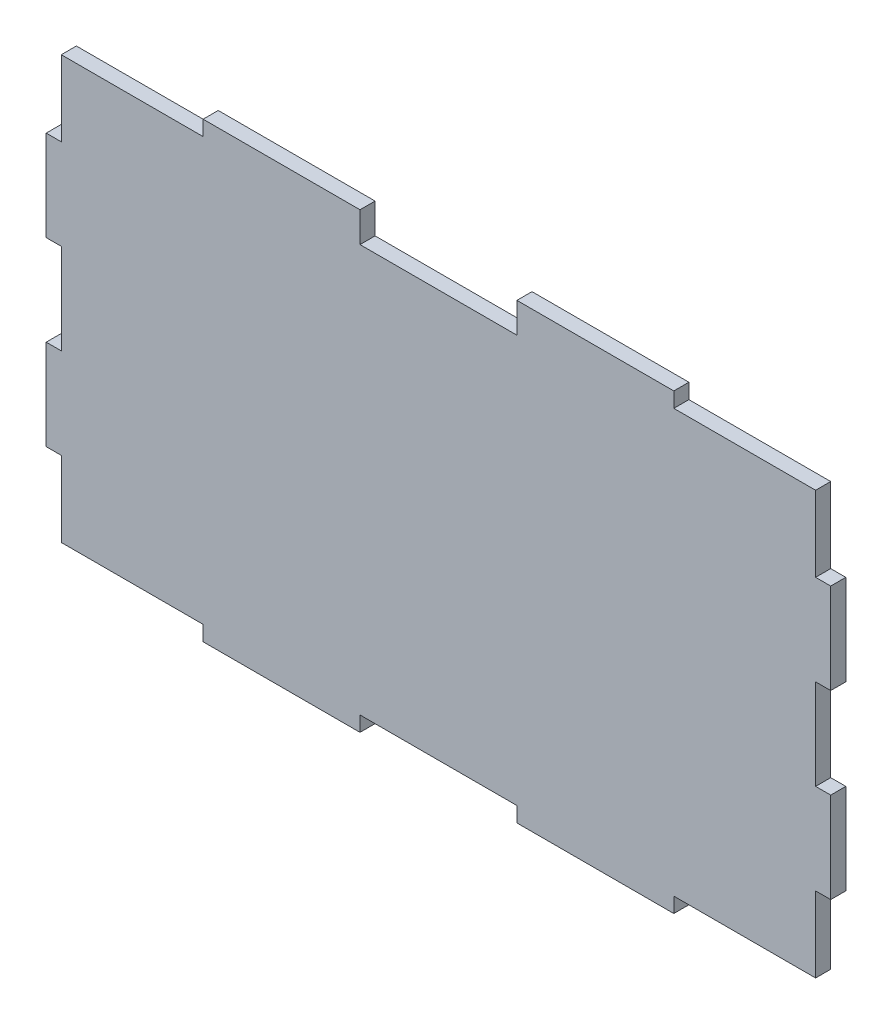
ISO-10303-21;
HEADER;
FILE_DESCRIPTION(('STEP AP214'),'2;1');
FILE_NAME('part.step','',(''),(''),'','','');
FILE_SCHEMA(('AUTOMOTIVE_DESIGN { 1 0 10303 214 1 1 1 1 }'));
ENDSEC;
DATA;
#1=APPLICATION_CONTEXT('core data for automotive mechanical design processes');
#2=APPLICATION_PROTOCOL_DEFINITION('international standard','automotive_design',2000,#1);
#3=PRODUCT_CONTEXT('',#1,'mechanical');
#4=PRODUCT('Part','Part','',(#3));
#5=PRODUCT_RELATED_PRODUCT_CATEGORY('part','',(#4));
#6=PRODUCT_DEFINITION_FORMATION('','',#4);
#7=PRODUCT_DEFINITION_CONTEXT('part definition',#1,'design');
#8=PRODUCT_DEFINITION('design','',#6,#7);
#9=PRODUCT_DEFINITION_SHAPE('','',#8);
#10=(LENGTH_UNIT() NAMED_UNIT(*) SI_UNIT(.MILLI.,.METRE.));
#11=(NAMED_UNIT(*) PLANE_ANGLE_UNIT() SI_UNIT($,.RADIAN.));
#12=(NAMED_UNIT(*) SI_UNIT($,.STERADIAN.) SOLID_ANGLE_UNIT());
#13=UNCERTAINTY_MEASURE_WITH_UNIT(LENGTH_MEASURE(1.E-05),#10,'distance_accuracy_value','');
#14=(GEOMETRIC_REPRESENTATION_CONTEXT(3) GLOBAL_UNCERTAINTY_ASSIGNED_CONTEXT((#13)) GLOBAL_UNIT_ASSIGNED_CONTEXT((#10,
#11,#12)) REPRESENTATION_CONTEXT('',''));
#15=CARTESIAN_POINT('',(0.,0.,0.));
#16=DIRECTION('',(0.,0.,1.));
#17=DIRECTION('',(1.,0.,0.));
#18=AXIS2_PLACEMENT_3D('',#15,#16,#17);
#19=CARTESIAN_POINT('',(52.,150.,5.));
#20=DIRECTION('',(1.,0.,0.));
#21=DIRECTION('',(0.,1.,0.));
#22=AXIS2_PLACEMENT_3D('',#19,#20,#21);
#23=PLANE('',#22);
#24=DIRECTION('',(0.,-1.,0.));
#25=VECTOR('',#24,1.);
#26=CARTESIAN_POINT('',(52.,150.,0.));
#27=LINE('',#26,#25);
#28=CARTESIAN_POINT('',(52.,150.,0.));
#29=VERTEX_POINT('',#28);
#30=CARTESIAN_POINT('',(52.,145.,0.));
#31=VERTEX_POINT('',#30);
#32=EDGE_CURVE('E303',#29,#31,#27,.T.);
#33=ORIENTED_EDGE('',*,*,#32,.T.);
#34=DIRECTION('',(0.,0.,-1.));
#35=VECTOR('',#34,1.);
#36=CARTESIAN_POINT('',(52.,145.,5.));
#37=LINE('',#36,#35);
#38=CARTESIAN_POINT('',(52.,145.,5.));
#39=VERTEX_POINT('',#38);
#40=EDGE_CURVE('E43',#39,#31,#37,.T.);
#41=ORIENTED_EDGE('',*,*,#40,.F.);
#42=DIRECTION('',(0.,-1.,0.));
#43=VECTOR('',#42,1.);
#44=CARTESIAN_POINT('',(52.,150.,5.));
#45=LINE('',#44,#43);
#46=CARTESIAN_POINT('',(52.,150.,5.));
#47=VERTEX_POINT('',#46);
#48=EDGE_CURVE('E371',#47,#39,#45,.T.);
#49=ORIENTED_EDGE('',*,*,#48,.F.);
#50=DIRECTION('',(0.,0.,-1.));
#51=VECTOR('',#50,1.);
#52=CARTESIAN_POINT('',(52.,150.,5.));
#53=LINE('',#52,#51);
#54=EDGE_CURVE('E302',#47,#29,#53,.T.);
#55=ORIENTED_EDGE('',*,*,#54,.T.);
#56=EDGE_LOOP('',(#33,#41,#49,#55));
#57=FACE_BOUND('',#56,.T.);
#58=ADVANCED_FACE('F36',(#57),#23,.F.);
#59=CARTESIAN_POINT('',(52.,145.,5.));
#60=DIRECTION('',(0.,-1.,0.));
#61=DIRECTION('',(0.,0.,-1.));
#62=AXIS2_PLACEMENT_3D('',#59,#60,#61);
#63=PLANE('',#62);
#64=DIRECTION('',(-1.,0.,0.));
#65=VECTOR('',#64,1.);
#66=CARTESIAN_POINT('',(52.,145.,0.));
#67=LINE('',#66,#65);
#68=CARTESIAN_POINT('',(5.,145.,0.));
#69=VERTEX_POINT('',#68);
#70=EDGE_CURVE('E306',#31,#69,#67,.T.);
#71=ORIENTED_EDGE('',*,*,#70,.T.);
#72=DIRECTION('',(0.,0.,-1.));
#73=VECTOR('',#72,1.);
#74=CARTESIAN_POINT('',(5.,145.,5.));
#75=LINE('',#74,#73);
#76=CARTESIAN_POINT('',(5.,145.,5.));
#77=VERTEX_POINT('',#76);
#78=EDGE_CURVE('E459',#77,#69,#75,.T.);
#79=ORIENTED_EDGE('',*,*,#78,.F.);
#80=DIRECTION('',(-1.,0.,0.));
#81=VECTOR('',#80,1.);
#82=CARTESIAN_POINT('',(52.,145.,5.));
#83=LINE('',#82,#81);
#84=EDGE_CURVE('E179',#39,#77,#83,.T.);
#85=ORIENTED_EDGE('',*,*,#84,.F.);
#86=ORIENTED_EDGE('',*,*,#40,.T.);
#87=EDGE_LOOP('',(#71,#79,#85,#86));
#88=FACE_BOUND('',#87,.T.);
#89=ADVANCED_FACE('F462',(#88),#63,.F.);
#90=CARTESIAN_POINT('',(5.,120.,5.));
#91=DIRECTION('',(1.,0.,0.));
#92=DIRECTION('',(0.,1.,0.));
#93=AXIS2_PLACEMENT_3D('',#90,#91,#92);
#94=PLANE('',#93);
#95=DIRECTION('',(0.,-1.,0.));
#96=VECTOR('',#95,1.);
#97=CARTESIAN_POINT('',(5.,120.,0.));
#98=LINE('',#97,#96);
#99=CARTESIAN_POINT('',(5.,120.,0.));
#100=VERTEX_POINT('',#99);
#101=EDGE_CURVE('E308',#69,#100,#98,.T.);
#102=ORIENTED_EDGE('',*,*,#101,.T.);
#103=DIRECTION('',(0.,0.,-1.));
#104=VECTOR('',#103,1.);
#105=CARTESIAN_POINT('',(5.,120.,5.));
#106=LINE('',#105,#104);
#107=CARTESIAN_POINT('',(5.,120.,5.));
#108=VERTEX_POINT('',#107);
#109=EDGE_CURVE('E456',#108,#100,#106,.T.);
#110=ORIENTED_EDGE('',*,*,#109,.F.);
#111=DIRECTION('',(0.,-1.,0.));
#112=VECTOR('',#111,1.);
#113=CARTESIAN_POINT('',(5.,120.,5.));
#114=LINE('',#113,#112);
#115=EDGE_CURVE('E483',#77,#108,#114,.T.);
#116=ORIENTED_EDGE('',*,*,#115,.F.);
#117=ORIENTED_EDGE('',*,*,#78,.T.);
#118=EDGE_LOOP('',(#102,#110,#116,#117));
#119=FACE_BOUND('',#118,.T.);
#120=ADVANCED_FACE('F474',(#119),#94,.F.);
#121=CARTESIAN_POINT('',(0.,120.,5.));
#122=DIRECTION('',(0.,-1.,0.));
#123=DIRECTION('',(0.,0.,-1.));
#124=AXIS2_PLACEMENT_3D('',#121,#122,#123);
#125=PLANE('',#124);
#126=DIRECTION('',(-1.,0.,0.));
#127=VECTOR('',#126,1.);
#128=CARTESIAN_POINT('',(0.,120.,0.));
#129=LINE('',#128,#127);
#130=CARTESIAN_POINT('',(0.,120.,0.));
#131=VERTEX_POINT('',#130);
#132=EDGE_CURVE('E310',#100,#131,#129,.T.);
#133=ORIENTED_EDGE('',*,*,#132,.T.);
#134=DIRECTION('',(0.,0.,-1.));
#135=VECTOR('',#134,1.);
#136=CARTESIAN_POINT('',(0.,120.,5.));
#137=LINE('',#136,#135);
#138=CARTESIAN_POINT('',(0.,120.,5.));
#139=VERTEX_POINT('',#138);
#140=EDGE_CURVE('E453',#139,#131,#137,.T.);
#141=ORIENTED_EDGE('',*,*,#140,.F.);
#142=DIRECTION('',(-1.,0.,0.));
#143=VECTOR('',#142,1.);
#144=CARTESIAN_POINT('',(0.,120.,5.));
#145=LINE('',#144,#143);
#146=EDGE_CURVE('E480',#108,#139,#145,.T.);
#147=ORIENTED_EDGE('',*,*,#146,.F.);
#148=ORIENTED_EDGE('',*,*,#109,.T.);
#149=EDGE_LOOP('',(#133,#141,#147,#148));
#150=FACE_BOUND('',#149,.T.);
#151=ADVANCED_FACE('F478',(#150),#125,.F.);
#152=CARTESIAN_POINT('',(0.,90.,5.));
#153=DIRECTION('',(1.,0.,0.));
#154=DIRECTION('',(0.,0.,-1.));
#155=AXIS2_PLACEMENT_3D('',#152,#153,#154);
#156=PLANE('',#155);
#157=DIRECTION('',(0.,-1.,0.));
#158=VECTOR('',#157,1.);
#159=CARTESIAN_POINT('',(0.,90.,0.));
#160=LINE('',#159,#158);
#161=CARTESIAN_POINT('',(0.,90.,0.));
#162=VERTEX_POINT('',#161);
#163=EDGE_CURVE('E312',#131,#162,#160,.T.);
#164=ORIENTED_EDGE('',*,*,#163,.T.);
#165=DIRECTION('',(0.,0.,-1.));
#166=VECTOR('',#165,1.);
#167=CARTESIAN_POINT('',(0.,90.,5.));
#168=LINE('',#167,#166);
#169=CARTESIAN_POINT('',(0.,90.,5.));
#170=VERTEX_POINT('',#169);
#171=EDGE_CURVE('E450',#170,#162,#168,.T.);
#172=ORIENTED_EDGE('',*,*,#171,.F.);
#173=DIRECTION('',(0.,-1.,0.));
#174=VECTOR('',#173,1.);
#175=CARTESIAN_POINT('',(0.,90.,5.));
#176=LINE('',#175,#174);
#177=EDGE_CURVE('E482',#139,#170,#176,.T.);
#178=ORIENTED_EDGE('',*,*,#177,.F.);
#179=ORIENTED_EDGE('',*,*,#140,.T.);
#180=EDGE_LOOP('',(#164,#172,#178,#179));
#181=FACE_BOUND('',#180,.T.);
#182=ADVANCED_FACE('F586',(#181),#156,.F.);
#183=CARTESIAN_POINT('',(5.,90.,5.));
#184=DIRECTION('',(0.,1.,0.));
#185=DIRECTION('',(0.,0.,1.));
#186=AXIS2_PLACEMENT_3D('',#183,#184,#185);
#187=PLANE('',#186);
#188=DIRECTION('',(1.,0.,0.));
#189=VECTOR('',#188,1.);
#190=CARTESIAN_POINT('',(5.,90.,0.));
#191=LINE('',#190,#189);
#192=CARTESIAN_POINT('',(5.,90.,0.));
#193=VERTEX_POINT('',#192);
#194=EDGE_CURVE('E314',#162,#193,#191,.T.);
#195=ORIENTED_EDGE('',*,*,#194,.T.);
#196=DIRECTION('',(0.,0.,-1.));
#197=VECTOR('',#196,1.);
#198=CARTESIAN_POINT('',(5.,90.,5.));
#199=LINE('',#198,#197);
#200=CARTESIAN_POINT('',(5.,90.,5.));
#201=VERTEX_POINT('',#200);
#202=EDGE_CURVE('E447',#201,#193,#199,.T.);
#203=ORIENTED_EDGE('',*,*,#202,.F.);
#204=DIRECTION('',(1.,0.,0.));
#205=VECTOR('',#204,1.);
#206=CARTESIAN_POINT('',(5.,90.,5.));
#207=LINE('',#206,#205);
#208=EDGE_CURVE('E485',#170,#201,#207,.T.);
#209=ORIENTED_EDGE('',*,*,#208,.F.);
#210=ORIENTED_EDGE('',*,*,#171,.T.);
#211=EDGE_LOOP('',(#195,#203,#209,#210));
#212=FACE_BOUND('',#211,.T.);
#213=ADVANCED_FACE('F589',(#212),#187,.F.);
#214=CARTESIAN_POINT('',(5.,60.,5.));
#215=DIRECTION('',(1.,0.,0.));
#216=DIRECTION('',(0.,0.,-1.));
#217=AXIS2_PLACEMENT_3D('',#214,#215,#216);
#218=PLANE('',#217);
#219=DIRECTION('',(0.,-1.,0.));
#220=VECTOR('',#219,1.);
#221=CARTESIAN_POINT('',(5.,60.,0.));
#222=LINE('',#221,#220);
#223=CARTESIAN_POINT('',(5.,60.,0.));
#224=VERTEX_POINT('',#223);
#225=EDGE_CURVE('E316',#193,#224,#222,.T.);
#226=ORIENTED_EDGE('',*,*,#225,.T.);
#227=DIRECTION('',(0.,0.,-1.));
#228=VECTOR('',#227,1.);
#229=CARTESIAN_POINT('',(5.,60.,5.));
#230=LINE('',#229,#228);
#231=CARTESIAN_POINT('',(5.,60.,5.));
#232=VERTEX_POINT('',#231);
#233=EDGE_CURVE('E444',#232,#224,#230,.T.);
#234=ORIENTED_EDGE('',*,*,#233,.F.);
#235=DIRECTION('',(0.,-1.,0.));
#236=VECTOR('',#235,1.);
#237=CARTESIAN_POINT('',(5.,60.,5.));
#238=LINE('',#237,#236);
#239=EDGE_CURVE('E491',#201,#232,#238,.T.);
#240=ORIENTED_EDGE('',*,*,#239,.F.);
#241=ORIENTED_EDGE('',*,*,#202,.T.);
#242=EDGE_LOOP('',(#226,#234,#240,#241));
#243=FACE_BOUND('',#242,.T.);
#244=ADVANCED_FACE('F593',(#243),#218,.F.);
#245=CARTESIAN_POINT('',(5.,60.,5.));
#246=DIRECTION('',(0.,-1.,0.));
#247=DIRECTION('',(0.,0.,-1.));
#248=AXIS2_PLACEMENT_3D('',#245,#246,#247);
#249=PLANE('',#248);
#250=DIRECTION('',(-1.,0.,0.));
#251=VECTOR('',#250,1.);
#252=CARTESIAN_POINT('',(5.,60.,0.));
#253=LINE('',#252,#251);
#254=CARTESIAN_POINT('',(0.,60.,0.));
#255=VERTEX_POINT('',#254);
#256=EDGE_CURVE('E318',#224,#255,#253,.T.);
#257=ORIENTED_EDGE('',*,*,#256,.T.);
#258=DIRECTION('',(0.,0.,-1.));
#259=VECTOR('',#258,1.);
#260=CARTESIAN_POINT('',(0.,60.,5.));
#261=LINE('',#260,#259);
#262=CARTESIAN_POINT('',(0.,60.,5.));
#263=VERTEX_POINT('',#262);
#264=EDGE_CURVE('E441',#263,#255,#261,.T.);
#265=ORIENTED_EDGE('',*,*,#264,.F.);
#266=DIRECTION('',(-1.,0.,0.));
#267=VECTOR('',#266,1.);
#268=CARTESIAN_POINT('',(5.,60.,5.));
#269=LINE('',#268,#267);
#270=EDGE_CURVE('E493',#232,#263,#269,.T.);
#271=ORIENTED_EDGE('',*,*,#270,.F.);
#272=ORIENTED_EDGE('',*,*,#233,.T.);
#273=EDGE_LOOP('',(#257,#265,#271,#272));
#274=FACE_BOUND('',#273,.T.);
#275=ADVANCED_FACE('F597',(#274),#249,.F.);
#276=CARTESIAN_POINT('',(0.,30.,5.));
#277=DIRECTION('',(1.,0.,0.));
#278=DIRECTION('',(0.,0.,-1.));
#279=AXIS2_PLACEMENT_3D('',#276,#277,#278);
#280=PLANE('',#279);
#281=DIRECTION('',(0.,-1.,0.));
#282=VECTOR('',#281,1.);
#283=CARTESIAN_POINT('',(0.,30.,0.));
#284=LINE('',#283,#282);
#285=CARTESIAN_POINT('',(0.,30.,0.));
#286=VERTEX_POINT('',#285);
#287=EDGE_CURVE('E320',#255,#286,#284,.T.);
#288=ORIENTED_EDGE('',*,*,#287,.T.);
#289=DIRECTION('',(0.,0.,-1.));
#290=VECTOR('',#289,1.);
#291=CARTESIAN_POINT('',(0.,30.,5.));
#292=LINE('',#291,#290);
#293=CARTESIAN_POINT('',(0.,30.,5.));
#294=VERTEX_POINT('',#293);
#295=EDGE_CURVE('E438',#294,#286,#292,.T.);
#296=ORIENTED_EDGE('',*,*,#295,.F.);
#297=DIRECTION('',(0.,-1.,0.));
#298=VECTOR('',#297,1.);
#299=CARTESIAN_POINT('',(0.,30.,5.));
#300=LINE('',#299,#298);
#301=EDGE_CURVE('E495',#263,#294,#300,.T.);
#302=ORIENTED_EDGE('',*,*,#301,.F.);
#303=ORIENTED_EDGE('',*,*,#264,.T.);
#304=EDGE_LOOP('',(#288,#296,#302,#303));
#305=FACE_BOUND('',#304,.T.);
#306=ADVANCED_FACE('F601',(#305),#280,.F.);
#307=CARTESIAN_POINT('',(0.,30.,5.));
#308=DIRECTION('',(0.,1.,0.));
#309=DIRECTION('',(0.,0.,1.));
#310=AXIS2_PLACEMENT_3D('',#307,#308,#309);
#311=PLANE('',#310);
#312=DIRECTION('',(1.,0.,0.));
#313=VECTOR('',#312,1.);
#314=CARTESIAN_POINT('',(0.,30.,0.));
#315=LINE('',#314,#313);
#316=CARTESIAN_POINT('',(5.,30.,0.));
#317=VERTEX_POINT('',#316);
#318=EDGE_CURVE('E322',#286,#317,#315,.T.);
#319=ORIENTED_EDGE('',*,*,#318,.T.);
#320=DIRECTION('',(0.,0.,-1.));
#321=VECTOR('',#320,1.);
#322=CARTESIAN_POINT('',(5.,30.,5.));
#323=LINE('',#322,#321);
#324=CARTESIAN_POINT('',(5.,30.,5.));
#325=VERTEX_POINT('',#324);
#326=EDGE_CURVE('E435',#325,#317,#323,.T.);
#327=ORIENTED_EDGE('',*,*,#326,.F.);
#328=DIRECTION('',(1.,0.,0.));
#329=VECTOR('',#328,1.);
#330=CARTESIAN_POINT('',(0.,30.,5.));
#331=LINE('',#330,#329);
#332=EDGE_CURVE('E497',#294,#325,#331,.T.);
#333=ORIENTED_EDGE('',*,*,#332,.F.);
#334=ORIENTED_EDGE('',*,*,#295,.T.);
#335=EDGE_LOOP('',(#319,#327,#333,#334));
#336=FACE_BOUND('',#335,.T.);
#337=ADVANCED_FACE('F605',(#336),#311,.F.);
#338=CARTESIAN_POINT('',(5.,30.,5.));
#339=DIRECTION('',(1.,0.,0.));
#340=DIRECTION('',(0.,1.,0.));
#341=AXIS2_PLACEMENT_3D('',#338,#339,#340);
#342=PLANE('',#341);
#343=DIRECTION('',(0.,-1.,0.));
#344=VECTOR('',#343,1.);
#345=CARTESIAN_POINT('',(5.,30.,0.));
#346=LINE('',#345,#344);
#347=CARTESIAN_POINT('',(5.,5.,0.));
#348=VERTEX_POINT('',#347);
#349=EDGE_CURVE('E324',#317,#348,#346,.T.);
#350=ORIENTED_EDGE('',*,*,#349,.T.);
#351=DIRECTION('',(0.,0.,-1.));
#352=VECTOR('',#351,1.);
#353=CARTESIAN_POINT('',(5.,5.,5.));
#354=LINE('',#353,#352);
#355=CARTESIAN_POINT('',(5.,5.,5.));
#356=VERTEX_POINT('',#355);
#357=EDGE_CURVE('E432',#356,#348,#354,.T.);
#358=ORIENTED_EDGE('',*,*,#357,.F.);
#359=DIRECTION('',(0.,-1.,0.));
#360=VECTOR('',#359,1.);
#361=CARTESIAN_POINT('',(5.,30.,5.));
#362=LINE('',#361,#360);
#363=EDGE_CURVE('E499',#325,#356,#362,.T.);
#364=ORIENTED_EDGE('',*,*,#363,.F.);
#365=ORIENTED_EDGE('',*,*,#326,.T.);
#366=EDGE_LOOP('',(#350,#358,#364,#365));
#367=FACE_BOUND('',#366,.T.);
#368=ADVANCED_FACE('F609',(#367),#342,.F.);
#369=CARTESIAN_POINT('',(52.,5.,5.));
#370=DIRECTION('',(0.,1.,0.));
#371=DIRECTION('',(0.,0.,1.));
#372=AXIS2_PLACEMENT_3D('',#369,#370,#371);
#373=PLANE('',#372);
#374=DIRECTION('',(1.,0.,0.));
#375=VECTOR('',#374,1.);
#376=CARTESIAN_POINT('',(52.,5.,0.));
#377=LINE('',#376,#375);
#378=CARTESIAN_POINT('',(52.,5.,0.));
#379=VERTEX_POINT('',#378);
#380=EDGE_CURVE('E326',#348,#379,#377,.T.);
#381=ORIENTED_EDGE('',*,*,#380,.T.);
#382=DIRECTION('',(0.,0.,-1.));
#383=VECTOR('',#382,1.);
#384=CARTESIAN_POINT('',(52.,5.,5.));
#385=LINE('',#384,#383);
#386=CARTESIAN_POINT('',(52.,5.,5.));
#387=VERTEX_POINT('',#386);
#388=EDGE_CURVE('E429',#387,#379,#385,.T.);
#389=ORIENTED_EDGE('',*,*,#388,.F.);
#390=DIRECTION('',(1.,0.,0.));
#391=VECTOR('',#390,1.);
#392=CARTESIAN_POINT('',(52.,5.,5.));
#393=LINE('',#392,#391);
#394=EDGE_CURVE('E501',#356,#387,#393,.T.);
#395=ORIENTED_EDGE('',*,*,#394,.F.);
#396=ORIENTED_EDGE('',*,*,#357,.T.);
#397=EDGE_LOOP('',(#381,#389,#395,#396));
#398=FACE_BOUND('',#397,.T.);
#399=ADVANCED_FACE('F613',(#398),#373,.F.);
#400=CARTESIAN_POINT('',(52.,0.,5.));
#401=DIRECTION('',(1.,0.,0.));
#402=DIRECTION('',(0.,1.,0.));
#403=AXIS2_PLACEMENT_3D('',#400,#401,#402);
#404=PLANE('',#403);
#405=DIRECTION('',(0.,-1.,0.));
#406=VECTOR('',#405,1.);
#407=CARTESIAN_POINT('',(52.,0.,0.));
#408=LINE('',#407,#406);
#409=CARTESIAN_POINT('',(52.,0.,0.));
#410=VERTEX_POINT('',#409);
#411=EDGE_CURVE('E328',#379,#410,#408,.T.);
#412=ORIENTED_EDGE('',*,*,#411,.T.);
#413=DIRECTION('',(0.,0.,-1.));
#414=VECTOR('',#413,1.);
#415=CARTESIAN_POINT('',(52.,0.,5.));
#416=LINE('',#415,#414);
#417=CARTESIAN_POINT('',(52.,0.,5.));
#418=VERTEX_POINT('',#417);
#419=EDGE_CURVE('E426',#418,#410,#416,.T.);
#420=ORIENTED_EDGE('',*,*,#419,.F.);
#421=DIRECTION('',(0.,-1.,0.));
#422=VECTOR('',#421,1.);
#423=CARTESIAN_POINT('',(52.,0.,5.));
#424=LINE('',#423,#422);
#425=EDGE_CURVE('E503',#387,#418,#424,.T.);
#426=ORIENTED_EDGE('',*,*,#425,.F.);
#427=ORIENTED_EDGE('',*,*,#388,.T.);
#428=EDGE_LOOP('',(#412,#420,#426,#427));
#429=FACE_BOUND('',#428,.T.);
#430=ADVANCED_FACE('F617',(#429),#404,.F.);
#431=CARTESIAN_POINT('',(52.,0.,5.));
#432=DIRECTION('',(0.,1.,0.));
#433=DIRECTION('',(0.,0.,1.));
#434=AXIS2_PLACEMENT_3D('',#431,#432,#433);
#435=PLANE('',#434);
#436=DIRECTION('',(1.,0.,0.));
#437=VECTOR('',#436,1.);
#438=CARTESIAN_POINT('',(52.,0.,0.));
#439=LINE('',#438,#437);
#440=CARTESIAN_POINT('',(104.,0.,0.));
#441=VERTEX_POINT('',#440);
#442=EDGE_CURVE('E330',#410,#441,#439,.T.);
#443=ORIENTED_EDGE('',*,*,#442,.T.);
#444=DIRECTION('',(0.,0.,-1.));
#445=VECTOR('',#444,1.);
#446=CARTESIAN_POINT('',(104.,0.,5.));
#447=LINE('',#446,#445);
#448=CARTESIAN_POINT('',(104.,0.,5.));
#449=VERTEX_POINT('',#448);
#450=EDGE_CURVE('E423',#449,#441,#447,.T.);
#451=ORIENTED_EDGE('',*,*,#450,.F.);
#452=DIRECTION('',(1.,0.,0.));
#453=VECTOR('',#452,1.);
#454=CARTESIAN_POINT('',(52.,0.,5.));
#455=LINE('',#454,#453);
#456=EDGE_CURVE('E505',#418,#449,#455,.T.);
#457=ORIENTED_EDGE('',*,*,#456,.F.);
#458=ORIENTED_EDGE('',*,*,#419,.T.);
#459=EDGE_LOOP('',(#443,#451,#457,#458));
#460=FACE_BOUND('',#459,.T.);
#461=ADVANCED_FACE('F621',(#460),#435,.F.);
#462=CARTESIAN_POINT('',(104.,5.,5.));
#463=DIRECTION('',(-1.,0.,0.));
#464=DIRECTION('',(0.,-1.,0.));
#465=AXIS2_PLACEMENT_3D('',#462,#463,#464);
#466=PLANE('',#465);
#467=DIRECTION('',(0.,1.,0.));
#468=VECTOR('',#467,1.);
#469=CARTESIAN_POINT('',(104.,5.,0.));
#470=LINE('',#469,#468);
#471=CARTESIAN_POINT('',(104.,5.,0.));
#472=VERTEX_POINT('',#471);
#473=EDGE_CURVE('E332',#441,#472,#470,.T.);
#474=ORIENTED_EDGE('',*,*,#473,.T.);
#475=DIRECTION('',(0.,0.,-1.));
#476=VECTOR('',#475,1.);
#477=CARTESIAN_POINT('',(104.,5.,5.));
#478=LINE('',#477,#476);
#479=CARTESIAN_POINT('',(104.,5.,5.));
#480=VERTEX_POINT('',#479);
#481=EDGE_CURVE('E420',#480,#472,#478,.T.);
#482=ORIENTED_EDGE('',*,*,#481,.F.);
#483=DIRECTION('',(0.,1.,0.));
#484=VECTOR('',#483,1.);
#485=CARTESIAN_POINT('',(104.,5.,5.));
#486=LINE('',#485,#484);
#487=EDGE_CURVE('E507',#449,#480,#486,.T.);
#488=ORIENTED_EDGE('',*,*,#487,.F.);
#489=ORIENTED_EDGE('',*,*,#450,.T.);
#490=EDGE_LOOP('',(#474,#482,#488,#489));
#491=FACE_BOUND('',#490,.T.);
#492=ADVANCED_FACE('F625',(#491),#466,.F.);
#493=CARTESIAN_POINT('',(104.,5.,5.));
#494=DIRECTION('',(0.,1.,0.));
#495=DIRECTION('',(0.,0.,1.));
#496=AXIS2_PLACEMENT_3D('',#493,#494,#495);
#497=PLANE('',#496);
#498=DIRECTION('',(1.,0.,0.));
#499=VECTOR('',#498,1.);
#500=CARTESIAN_POINT('',(104.,5.,0.));
#501=LINE('',#500,#499);
#502=CARTESIAN_POINT('',(156.,5.,0.));
#503=VERTEX_POINT('',#502);
#504=EDGE_CURVE('E334',#472,#503,#501,.T.);
#505=ORIENTED_EDGE('',*,*,#504,.T.);
#506=DIRECTION('',(0.,0.,-1.));
#507=VECTOR('',#506,1.);
#508=CARTESIAN_POINT('',(156.,5.,5.));
#509=LINE('',#508,#507);
#510=CARTESIAN_POINT('',(156.,5.,5.));
#511=VERTEX_POINT('',#510);
#512=EDGE_CURVE('E417',#511,#503,#509,.T.);
#513=ORIENTED_EDGE('',*,*,#512,.F.);
#514=DIRECTION('',(1.,0.,0.));
#515=VECTOR('',#514,1.);
#516=CARTESIAN_POINT('',(104.,5.,5.));
#517=LINE('',#516,#515);
#518=EDGE_CURVE('E509',#480,#511,#517,.T.);
#519=ORIENTED_EDGE('',*,*,#518,.F.);
#520=ORIENTED_EDGE('',*,*,#481,.T.);
#521=EDGE_LOOP('',(#505,#513,#519,#520));
#522=FACE_BOUND('',#521,.T.);
#523=ADVANCED_FACE('F629',(#522),#497,.F.);
#524=CARTESIAN_POINT('',(156.,5.,5.));
#525=DIRECTION('',(1.,0.,0.));
#526=DIRECTION('',(0.,1.,0.));
#527=AXIS2_PLACEMENT_3D('',#524,#525,#526);
#528=PLANE('',#527);
#529=DIRECTION('',(0.,-1.,0.));
#530=VECTOR('',#529,1.);
#531=CARTESIAN_POINT('',(156.,5.,0.));
#532=LINE('',#531,#530);
#533=CARTESIAN_POINT('',(156.,0.,0.));
#534=VERTEX_POINT('',#533);
#535=EDGE_CURVE('E336',#503,#534,#532,.T.);
#536=ORIENTED_EDGE('',*,*,#535,.T.);
#537=DIRECTION('',(0.,0.,-1.));
#538=VECTOR('',#537,1.);
#539=CARTESIAN_POINT('',(156.,0.,5.));
#540=LINE('',#539,#538);
#541=CARTESIAN_POINT('',(156.,0.,5.));
#542=VERTEX_POINT('',#541);
#543=EDGE_CURVE('E414',#542,#534,#540,.T.);
#544=ORIENTED_EDGE('',*,*,#543,.F.);
#545=DIRECTION('',(0.,-1.,0.));
#546=VECTOR('',#545,1.);
#547=CARTESIAN_POINT('',(156.,5.,5.));
#548=LINE('',#547,#546);
#549=EDGE_CURVE('E511',#511,#542,#548,.T.);
#550=ORIENTED_EDGE('',*,*,#549,.F.);
#551=ORIENTED_EDGE('',*,*,#512,.T.);
#552=EDGE_LOOP('',(#536,#544,#550,#551));
#553=FACE_BOUND('',#552,.T.);
#554=ADVANCED_FACE('F633',(#553),#528,.F.);
#555=CARTESIAN_POINT('',(156.,0.,5.));
#556=DIRECTION('',(0.,1.,0.));
#557=DIRECTION('',(0.,0.,1.));
#558=AXIS2_PLACEMENT_3D('',#555,#556,#557);
#559=PLANE('',#558);
#560=DIRECTION('',(1.,0.,0.));
#561=VECTOR('',#560,1.);
#562=CARTESIAN_POINT('',(156.,0.,0.));
#563=LINE('',#562,#561);
#564=CARTESIAN_POINT('',(208.,0.,0.));
#565=VERTEX_POINT('',#564);
#566=EDGE_CURVE('E338',#534,#565,#563,.T.);
#567=ORIENTED_EDGE('',*,*,#566,.T.);
#568=DIRECTION('',(0.,0.,-1.));
#569=VECTOR('',#568,1.);
#570=CARTESIAN_POINT('',(208.,0.,5.));
#571=LINE('',#570,#569);
#572=CARTESIAN_POINT('',(208.,0.,5.));
#573=VERTEX_POINT('',#572);
#574=EDGE_CURVE('E411',#573,#565,#571,.T.);
#575=ORIENTED_EDGE('',*,*,#574,.F.);
#576=DIRECTION('',(1.,0.,0.));
#577=VECTOR('',#576,1.);
#578=CARTESIAN_POINT('',(156.,0.,5.));
#579=LINE('',#578,#577);
#580=EDGE_CURVE('E513',#542,#573,#579,.T.);
#581=ORIENTED_EDGE('',*,*,#580,.F.);
#582=ORIENTED_EDGE('',*,*,#543,.T.);
#583=EDGE_LOOP('',(#567,#575,#581,#582));
#584=FACE_BOUND('',#583,.T.);
#585=ADVANCED_FACE('F637',(#584),#559,.F.);
#586=CARTESIAN_POINT('',(208.,0.,5.));
#587=DIRECTION('',(-1.,0.,0.));
#588=DIRECTION('',(0.,0.,1.));
#589=AXIS2_PLACEMENT_3D('',#586,#587,#588);
#590=PLANE('',#589);
#591=DIRECTION('',(0.,1.,0.));
#592=VECTOR('',#591,1.);
#593=CARTESIAN_POINT('',(208.,0.,0.));
#594=LINE('',#593,#592);
#595=CARTESIAN_POINT('',(208.,5.,0.));
#596=VERTEX_POINT('',#595);
#597=EDGE_CURVE('E340',#565,#596,#594,.T.);
#598=ORIENTED_EDGE('',*,*,#597,.T.);
#599=DIRECTION('',(0.,0.,-1.));
#600=VECTOR('',#599,1.);
#601=CARTESIAN_POINT('',(208.,5.,5.));
#602=LINE('',#601,#600);
#603=CARTESIAN_POINT('',(208.,5.,5.));
#604=VERTEX_POINT('',#603);
#605=EDGE_CURVE('E408',#604,#596,#602,.T.);
#606=ORIENTED_EDGE('',*,*,#605,.F.);
#607=DIRECTION('',(0.,1.,0.));
#608=VECTOR('',#607,1.);
#609=CARTESIAN_POINT('',(208.,0.,5.));
#610=LINE('',#609,#608);
#611=EDGE_CURVE('E515',#573,#604,#610,.T.);
#612=ORIENTED_EDGE('',*,*,#611,.F.);
#613=ORIENTED_EDGE('',*,*,#574,.T.);
#614=EDGE_LOOP('',(#598,#606,#612,#613));
#615=FACE_BOUND('',#614,.T.);
#616=ADVANCED_FACE('F641',(#615),#590,.F.);
#617=CARTESIAN_POINT('',(208.,5.,5.));
#618=DIRECTION('',(0.,1.,0.));
#619=DIRECTION('',(0.,0.,1.));
#620=AXIS2_PLACEMENT_3D('',#617,#618,#619);
#621=PLANE('',#620);
#622=DIRECTION('',(1.,0.,0.));
#623=VECTOR('',#622,1.);
#624=CARTESIAN_POINT('',(208.,5.,0.));
#625=LINE('',#624,#623);
#626=CARTESIAN_POINT('',(255.,5.,0.));
#627=VERTEX_POINT('',#626);
#628=EDGE_CURVE('E342',#596,#627,#625,.T.);
#629=ORIENTED_EDGE('',*,*,#628,.T.);
#630=DIRECTION('',(0.,0.,-1.));
#631=VECTOR('',#630,1.);
#632=CARTESIAN_POINT('',(255.,5.,5.));
#633=LINE('',#632,#631);
#634=CARTESIAN_POINT('',(255.,5.,5.));
#635=VERTEX_POINT('',#634);
#636=EDGE_CURVE('E405',#635,#627,#633,.T.);
#637=ORIENTED_EDGE('',*,*,#636,.F.);
#638=DIRECTION('',(1.,0.,0.));
#639=VECTOR('',#638,1.);
#640=CARTESIAN_POINT('',(208.,5.,5.));
#641=LINE('',#640,#639);
#642=EDGE_CURVE('E517',#604,#635,#641,.T.);
#643=ORIENTED_EDGE('',*,*,#642,.F.);
#644=ORIENTED_EDGE('',*,*,#605,.T.);
#645=EDGE_LOOP('',(#629,#637,#643,#644));
#646=FACE_BOUND('',#645,.T.);
#647=ADVANCED_FACE('F645',(#646),#621,.F.);
#648=CARTESIAN_POINT('',(255.,30.,5.));
#649=DIRECTION('',(-1.,0.,0.));
#650=DIRECTION('',(0.,0.,1.));
#651=AXIS2_PLACEMENT_3D('',#648,#649,#650);
#652=PLANE('',#651);
#653=DIRECTION('',(0.,1.,0.));
#654=VECTOR('',#653,1.);
#655=CARTESIAN_POINT('',(255.,30.,0.));
#656=LINE('',#655,#654);
#657=CARTESIAN_POINT('',(255.,30.,0.));
#658=VERTEX_POINT('',#657);
#659=EDGE_CURVE('E344',#627,#658,#656,.T.);
#660=ORIENTED_EDGE('',*,*,#659,.T.);
#661=DIRECTION('',(0.,0.,-1.));
#662=VECTOR('',#661,1.);
#663=CARTESIAN_POINT('',(255.,30.,5.));
#664=LINE('',#663,#662);
#665=CARTESIAN_POINT('',(255.,30.,5.));
#666=VERTEX_POINT('',#665);
#667=EDGE_CURVE('E402',#666,#658,#664,.T.);
#668=ORIENTED_EDGE('',*,*,#667,.F.);
#669=DIRECTION('',(0.,1.,0.));
#670=VECTOR('',#669,1.);
#671=CARTESIAN_POINT('',(255.,30.,5.));
#672=LINE('',#671,#670);
#673=EDGE_CURVE('E519',#635,#666,#672,.T.);
#674=ORIENTED_EDGE('',*,*,#673,.F.);
#675=ORIENTED_EDGE('',*,*,#636,.T.);
#676=EDGE_LOOP('',(#660,#668,#674,#675));
#677=FACE_BOUND('',#676,.T.);
#678=ADVANCED_FACE('F649',(#677),#652,.F.);
#679=CARTESIAN_POINT('',(260.,30.,5.));
#680=DIRECTION('',(0.,1.,0.));
#681=DIRECTION('',(0.,0.,1.));
#682=AXIS2_PLACEMENT_3D('',#679,#680,#681);
#683=PLANE('',#682);
#684=DIRECTION('',(1.,0.,0.));
#685=VECTOR('',#684,1.);
#686=CARTESIAN_POINT('',(260.,30.,0.));
#687=LINE('',#686,#685);
#688=CARTESIAN_POINT('',(260.,30.,0.));
#689=VERTEX_POINT('',#688);
#690=EDGE_CURVE('E346',#658,#689,#687,.T.);
#691=ORIENTED_EDGE('',*,*,#690,.T.);
#692=DIRECTION('',(0.,0.,-1.));
#693=VECTOR('',#692,1.);
#694=CARTESIAN_POINT('',(260.,30.,5.));
#695=LINE('',#694,#693);
#696=CARTESIAN_POINT('',(260.,30.,5.));
#697=VERTEX_POINT('',#696);
#698=EDGE_CURVE('E399',#697,#689,#695,.T.);
#699=ORIENTED_EDGE('',*,*,#698,.F.);
#700=DIRECTION('',(1.,0.,0.));
#701=VECTOR('',#700,1.);
#702=CARTESIAN_POINT('',(260.,30.,5.));
#703=LINE('',#702,#701);
#704=EDGE_CURVE('E521',#666,#697,#703,.T.);
#705=ORIENTED_EDGE('',*,*,#704,.F.);
#706=ORIENTED_EDGE('',*,*,#667,.T.);
#707=EDGE_LOOP('',(#691,#699,#705,#706));
#708=FACE_BOUND('',#707,.T.);
#709=ADVANCED_FACE('F653',(#708),#683,.F.);
#710=CARTESIAN_POINT('',(260.,30.,5.));
#711=DIRECTION('',(-1.,0.,0.));
#712=DIRECTION('',(0.,0.,1.));
#713=AXIS2_PLACEMENT_3D('',#710,#711,#712);
#714=PLANE('',#713);
#715=DIRECTION('',(0.,1.,0.));
#716=VECTOR('',#715,1.);
#717=CARTESIAN_POINT('',(260.,30.,0.));
#718=LINE('',#717,#716);
#719=CARTESIAN_POINT('',(260.,60.,0.));
#720=VERTEX_POINT('',#719);
#721=EDGE_CURVE('E348',#689,#720,#718,.T.);
#722=ORIENTED_EDGE('',*,*,#721,.T.);
#723=DIRECTION('',(0.,0.,-1.));
#724=VECTOR('',#723,1.);
#725=CARTESIAN_POINT('',(260.,60.,5.));
#726=LINE('',#725,#724);
#727=CARTESIAN_POINT('',(260.,60.,5.));
#728=VERTEX_POINT('',#727);
#729=EDGE_CURVE('E396',#728,#720,#726,.T.);
#730=ORIENTED_EDGE('',*,*,#729,.F.);
#731=DIRECTION('',(0.,1.,0.));
#732=VECTOR('',#731,1.);
#733=CARTESIAN_POINT('',(260.,30.,5.));
#734=LINE('',#733,#732);
#735=EDGE_CURVE('E523',#697,#728,#734,.T.);
#736=ORIENTED_EDGE('',*,*,#735,.F.);
#737=ORIENTED_EDGE('',*,*,#698,.T.);
#738=EDGE_LOOP('',(#722,#730,#736,#737));
#739=FACE_BOUND('',#738,.T.);
#740=ADVANCED_FACE('F657',(#739),#714,.F.);
#741=CARTESIAN_POINT('',(255.,60.,5.));
#742=DIRECTION('',(0.,-1.,0.));
#743=DIRECTION('',(0.,0.,-1.));
#744=AXIS2_PLACEMENT_3D('',#741,#742,#743);
#745=PLANE('',#744);
#746=DIRECTION('',(-1.,0.,0.));
#747=VECTOR('',#746,1.);
#748=CARTESIAN_POINT('',(255.,60.,0.));
#749=LINE('',#748,#747);
#750=CARTESIAN_POINT('',(255.,60.,0.));
#751=VERTEX_POINT('',#750);
#752=EDGE_CURVE('E350',#720,#751,#749,.T.);
#753=ORIENTED_EDGE('',*,*,#752,.T.);
#754=DIRECTION('',(0.,0.,-1.));
#755=VECTOR('',#754,1.);
#756=CARTESIAN_POINT('',(255.,60.,5.));
#757=LINE('',#756,#755);
#758=CARTESIAN_POINT('',(255.,60.,5.));
#759=VERTEX_POINT('',#758);
#760=EDGE_CURVE('E393',#759,#751,#757,.T.);
#761=ORIENTED_EDGE('',*,*,#760,.F.);
#762=DIRECTION('',(-1.,0.,0.));
#763=VECTOR('',#762,1.);
#764=CARTESIAN_POINT('',(255.,60.,5.));
#765=LINE('',#764,#763);
#766=EDGE_CURVE('E525',#728,#759,#765,.T.);
#767=ORIENTED_EDGE('',*,*,#766,.F.);
#768=ORIENTED_EDGE('',*,*,#729,.T.);
#769=EDGE_LOOP('',(#753,#761,#767,#768));
#770=FACE_BOUND('',#769,.T.);
#771=ADVANCED_FACE('F661',(#770),#745,.F.);
#772=CARTESIAN_POINT('',(255.,60.,5.));
#773=DIRECTION('',(-1.,0.,0.));
#774=DIRECTION('',(0.,0.,1.));
#775=AXIS2_PLACEMENT_3D('',#772,#773,#774);
#776=PLANE('',#775);
#777=DIRECTION('',(0.,1.,0.));
#778=VECTOR('',#777,1.);
#779=CARTESIAN_POINT('',(255.,60.,0.));
#780=LINE('',#779,#778);
#781=CARTESIAN_POINT('',(255.,90.,0.));
#782=VERTEX_POINT('',#781);
#783=EDGE_CURVE('E352',#751,#782,#780,.T.);
#784=ORIENTED_EDGE('',*,*,#783,.T.);
#785=DIRECTION('',(0.,0.,-1.));
#786=VECTOR('',#785,1.);
#787=CARTESIAN_POINT('',(255.,90.,5.));
#788=LINE('',#787,#786);
#789=CARTESIAN_POINT('',(255.,90.,5.));
#790=VERTEX_POINT('',#789);
#791=EDGE_CURVE('E390',#790,#782,#788,.T.);
#792=ORIENTED_EDGE('',*,*,#791,.F.);
#793=DIRECTION('',(0.,1.,0.));
#794=VECTOR('',#793,1.);
#795=CARTESIAN_POINT('',(255.,60.,5.));
#796=LINE('',#795,#794);
#797=EDGE_CURVE('E527',#759,#790,#796,.T.);
#798=ORIENTED_EDGE('',*,*,#797,.F.);
#799=ORIENTED_EDGE('',*,*,#760,.T.);
#800=EDGE_LOOP('',(#784,#792,#798,#799));
#801=FACE_BOUND('',#800,.T.);
#802=ADVANCED_FACE('F665',(#801),#776,.F.);
#803=CARTESIAN_POINT('',(255.,90.,5.));
#804=DIRECTION('',(0.,1.,0.));
#805=DIRECTION('',(0.,0.,1.));
#806=AXIS2_PLACEMENT_3D('',#803,#804,#805);
#807=PLANE('',#806);
#808=DIRECTION('',(1.,0.,0.));
#809=VECTOR('',#808,1.);
#810=CARTESIAN_POINT('',(255.,90.,0.));
#811=LINE('',#810,#809);
#812=CARTESIAN_POINT('',(260.,90.,0.));
#813=VERTEX_POINT('',#812);
#814=EDGE_CURVE('E354',#782,#813,#811,.T.);
#815=ORIENTED_EDGE('',*,*,#814,.T.);
#816=DIRECTION('',(0.,0.,-1.));
#817=VECTOR('',#816,1.);
#818=CARTESIAN_POINT('',(260.,90.,5.));
#819=LINE('',#818,#817);
#820=CARTESIAN_POINT('',(260.,90.,5.));
#821=VERTEX_POINT('',#820);
#822=EDGE_CURVE('E387',#821,#813,#819,.T.);
#823=ORIENTED_EDGE('',*,*,#822,.F.);
#824=DIRECTION('',(1.,0.,0.));
#825=VECTOR('',#824,1.);
#826=CARTESIAN_POINT('',(255.,90.,5.));
#827=LINE('',#826,#825);
#828=EDGE_CURVE('E529',#790,#821,#827,.T.);
#829=ORIENTED_EDGE('',*,*,#828,.F.);
#830=ORIENTED_EDGE('',*,*,#791,.T.);
#831=EDGE_LOOP('',(#815,#823,#829,#830));
#832=FACE_BOUND('',#831,.T.);
#833=ADVANCED_FACE('F669',(#832),#807,.F.);
#834=CARTESIAN_POINT('',(260.,90.,5.));
#835=DIRECTION('',(-1.,0.,0.));
#836=DIRECTION('',(0.,0.,1.));
#837=AXIS2_PLACEMENT_3D('',#834,#835,#836);
#838=PLANE('',#837);
#839=DIRECTION('',(0.,1.,0.));
#840=VECTOR('',#839,1.);
#841=CARTESIAN_POINT('',(260.,90.,0.));
#842=LINE('',#841,#840);
#843=CARTESIAN_POINT('',(260.,120.,0.));
#844=VERTEX_POINT('',#843);
#845=EDGE_CURVE('E356',#813,#844,#842,.T.);
#846=ORIENTED_EDGE('',*,*,#845,.T.);
#847=DIRECTION('',(0.,0.,-1.));
#848=VECTOR('',#847,1.);
#849=CARTESIAN_POINT('',(260.,120.,5.));
#850=LINE('',#849,#848);
#851=CARTESIAN_POINT('',(260.,120.,5.));
#852=VERTEX_POINT('',#851);
#853=EDGE_CURVE('E384',#852,#844,#850,.T.);
#854=ORIENTED_EDGE('',*,*,#853,.F.);
#855=DIRECTION('',(0.,1.,0.));
#856=VECTOR('',#855,1.);
#857=CARTESIAN_POINT('',(260.,90.,5.));
#858=LINE('',#857,#856);
#859=EDGE_CURVE('E531',#821,#852,#858,.T.);
#860=ORIENTED_EDGE('',*,*,#859,.F.);
#861=ORIENTED_EDGE('',*,*,#822,.T.);
#862=EDGE_LOOP('',(#846,#854,#860,#861));
#863=FACE_BOUND('',#862,.T.);
#864=ADVANCED_FACE('F673',(#863),#838,.F.);
#865=CARTESIAN_POINT('',(260.,120.,5.));
#866=DIRECTION('',(0.,-1.,0.));
#867=DIRECTION('',(0.,0.,-1.));
#868=AXIS2_PLACEMENT_3D('',#865,#866,#867);
#869=PLANE('',#868);
#870=DIRECTION('',(-1.,0.,0.));
#871=VECTOR('',#870,1.);
#872=CARTESIAN_POINT('',(260.,120.,0.));
#873=LINE('',#872,#871);
#874=CARTESIAN_POINT('',(255.,120.,0.));
#875=VERTEX_POINT('',#874);
#876=EDGE_CURVE('E358',#844,#875,#873,.T.);
#877=ORIENTED_EDGE('',*,*,#876,.T.);
#878=DIRECTION('',(0.,0.,-1.));
#879=VECTOR('',#878,1.);
#880=CARTESIAN_POINT('',(255.,120.,5.));
#881=LINE('',#880,#879);
#882=CARTESIAN_POINT('',(255.,120.,5.));
#883=VERTEX_POINT('',#882);
#884=EDGE_CURVE('E381',#883,#875,#881,.T.);
#885=ORIENTED_EDGE('',*,*,#884,.F.);
#886=DIRECTION('',(-1.,0.,0.));
#887=VECTOR('',#886,1.);
#888=CARTESIAN_POINT('',(260.,120.,5.));
#889=LINE('',#888,#887);
#890=EDGE_CURVE('E533',#852,#883,#889,.T.);
#891=ORIENTED_EDGE('',*,*,#890,.F.);
#892=ORIENTED_EDGE('',*,*,#853,.T.);
#893=EDGE_LOOP('',(#877,#885,#891,#892));
#894=FACE_BOUND('',#893,.T.);
#895=ADVANCED_FACE('F677',(#894),#869,.F.);
#896=CARTESIAN_POINT('',(255.,120.,5.));
#897=DIRECTION('',(-1.,0.,0.));
#898=DIRECTION('',(0.,0.,1.));
#899=AXIS2_PLACEMENT_3D('',#896,#897,#898);
#900=PLANE('',#899);
#901=DIRECTION('',(0.,1.,0.));
#902=VECTOR('',#901,1.);
#903=CARTESIAN_POINT('',(255.,120.,0.));
#904=LINE('',#903,#902);
#905=CARTESIAN_POINT('',(255.,145.,0.));
#906=VERTEX_POINT('',#905);
#907=EDGE_CURVE('E360',#875,#906,#904,.T.);
#908=ORIENTED_EDGE('',*,*,#907,.T.);
#909=DIRECTION('',(0.,0.,-1.));
#910=VECTOR('',#909,1.);
#911=CARTESIAN_POINT('',(255.,145.,5.));
#912=LINE('',#911,#910);
#913=CARTESIAN_POINT('',(255.,145.,5.));
#914=VERTEX_POINT('',#913);
#915=EDGE_CURVE('E378',#914,#906,#912,.T.);
#916=ORIENTED_EDGE('',*,*,#915,.F.);
#917=DIRECTION('',(0.,1.,0.));
#918=VECTOR('',#917,1.);
#919=CARTESIAN_POINT('',(255.,120.,5.));
#920=LINE('',#919,#918);
#921=EDGE_CURVE('E535',#883,#914,#920,.T.);
#922=ORIENTED_EDGE('',*,*,#921,.F.);
#923=ORIENTED_EDGE('',*,*,#884,.T.);
#924=EDGE_LOOP('',(#908,#916,#922,#923));
#925=FACE_BOUND('',#924,.T.);
#926=ADVANCED_FACE('F681',(#925),#900,.F.);
#927=CARTESIAN_POINT('',(208.,145.,5.));
#928=DIRECTION('',(0.,-1.,0.));
#929=DIRECTION('',(0.,0.,-1.));
#930=AXIS2_PLACEMENT_3D('',#927,#928,#929);
#931=PLANE('',#930);
#932=DIRECTION('',(-1.,0.,0.));
#933=VECTOR('',#932,1.);
#934=CARTESIAN_POINT('',(208.,145.,0.));
#935=LINE('',#934,#933);
#936=CARTESIAN_POINT('',(208.,145.,0.));
#937=VERTEX_POINT('',#936);
#938=EDGE_CURVE('E362',#906,#937,#935,.T.);
#939=ORIENTED_EDGE('',*,*,#938,.T.);
#940=DIRECTION('',(0.,0.,-1.));
#941=VECTOR('',#940,1.);
#942=CARTESIAN_POINT('',(208.,145.,5.));
#943=LINE('',#942,#941);
#944=CARTESIAN_POINT('',(208.,145.,5.));
#945=VERTEX_POINT('',#944);
#946=EDGE_CURVE('E375',#945,#937,#943,.T.);
#947=ORIENTED_EDGE('',*,*,#946,.F.);
#948=DIRECTION('',(-1.,0.,0.));
#949=VECTOR('',#948,1.);
#950=CARTESIAN_POINT('',(208.,145.,5.));
#951=LINE('',#950,#949);
#952=EDGE_CURVE('E537',#914,#945,#951,.T.);
#953=ORIENTED_EDGE('',*,*,#952,.F.);
#954=ORIENTED_EDGE('',*,*,#915,.T.);
#955=EDGE_LOOP('',(#939,#947,#953,#954));
#956=FACE_BOUND('',#955,.T.);
#957=ADVANCED_FACE('F543',(#956),#931,.F.);
#958=CARTESIAN_POINT('',(208.,150.,5.));
#959=DIRECTION('',(-1.,0.,0.));
#960=DIRECTION('',(0.,0.,1.));
#961=AXIS2_PLACEMENT_3D('',#958,#959,#960);
#962=PLANE('',#961);
#963=DIRECTION('',(0.,1.,0.));
#964=VECTOR('',#963,1.);
#965=CARTESIAN_POINT('',(208.,150.,0.));
#966=LINE('',#965,#964);
#967=CARTESIAN_POINT('',(208.,150.,0.));
#968=VERTEX_POINT('',#967);
#969=EDGE_CURVE('E364',#937,#968,#966,.T.);
#970=ORIENTED_EDGE('',*,*,#969,.T.);
#971=DIRECTION('',(0.,0.,-1.));
#972=VECTOR('',#971,1.);
#973=CARTESIAN_POINT('',(208.,150.,5.));
#974=LINE('',#973,#972);
#975=CARTESIAN_POINT('',(208.,150.,5.));
#976=VERTEX_POINT('',#975);
#977=EDGE_CURVE('E290',#976,#968,#974,.T.);
#978=ORIENTED_EDGE('',*,*,#977,.F.);
#979=DIRECTION('',(0.,1.,0.));
#980=VECTOR('',#979,1.);
#981=CARTESIAN_POINT('',(208.,150.,5.));
#982=LINE('',#981,#980);
#983=EDGE_CURVE('E281',#945,#976,#982,.T.);
#984=ORIENTED_EDGE('',*,*,#983,.F.);
#985=ORIENTED_EDGE('',*,*,#946,.T.);
#986=EDGE_LOOP('',(#970,#978,#984,#985));
#987=FACE_BOUND('',#986,.T.);
#988=ADVANCED_FACE('F547',(#987),#962,.F.);
#989=CARTESIAN_POINT('',(156.,150.,5.));
#990=DIRECTION('',(0.,-1.,0.));
#991=DIRECTION('',(0.,0.,-1.));
#992=AXIS2_PLACEMENT_3D('',#989,#990,#991);
#993=PLANE('',#992);
#994=DIRECTION('',(-1.,0.,0.));
#995=VECTOR('',#994,1.);
#996=CARTESIAN_POINT('',(156.,150.,0.));
#997=LINE('',#996,#995);
#998=CARTESIAN_POINT('',(156.,150.,0.));
#999=VERTEX_POINT('',#998);
#1000=EDGE_CURVE('E289',#968,#999,#997,.T.);
#1001=ORIENTED_EDGE('',*,*,#1000,.T.);
#1002=DIRECTION('',(0.,0.,-1.));
#1003=VECTOR('',#1002,1.);
#1004=CARTESIAN_POINT('',(156.,150.,5.));
#1005=LINE('',#1004,#1003);
#1006=CARTESIAN_POINT('',(156.,150.,5.));
#1007=VERTEX_POINT('',#1006);
#1008=EDGE_CURVE('E286',#1007,#999,#1005,.T.);
#1009=ORIENTED_EDGE('',*,*,#1008,.F.);
#1010=DIRECTION('',(-1.,0.,0.));
#1011=VECTOR('',#1010,1.);
#1012=CARTESIAN_POINT('',(156.,150.,5.));
#1013=LINE('',#1012,#1011);
#1014=EDGE_CURVE('E273',#976,#1007,#1013,.T.);
#1015=ORIENTED_EDGE('',*,*,#1014,.F.);
#1016=ORIENTED_EDGE('',*,*,#977,.T.);
#1017=EDGE_LOOP('',(#1001,#1009,#1015,#1016));
#1018=FACE_BOUND('',#1017,.T.);
#1019=ADVANCED_FACE('F287',(#1018),#993,.F.);
#1020=CARTESIAN_POINT('',(156.,145.,5.));
#1021=DIRECTION('',(1.,0.,0.));
#1022=DIRECTION('',(0.,1.,0.));
#1023=AXIS2_PLACEMENT_3D('',#1020,#1021,#1022);
#1024=PLANE('',#1023);
#1025=DIRECTION('',(0.,-1.,0.));
#1026=VECTOR('',#1025,1.);
#1027=CARTESIAN_POINT('',(156.,145.,0.));
#1028=LINE('',#1027,#1026);
#1029=CARTESIAN_POINT('',(156.,140.,0.));
#1030=VERTEX_POINT('',#1029);
#1031=EDGE_CURVE('E50',#999,#1030,#1028,.T.);
#1032=ORIENTED_EDGE('',*,*,#1031,.T.);
#1033=DIRECTION('',(0.,0.,1.));
#1034=VECTOR('',#1033,1.);
#1035=CARTESIAN_POINT('',(156.,140.,-5.));
#1036=LINE('',#1035,#1034);
#1037=CARTESIAN_POINT('',(156.,140.,5.));
#1038=VERTEX_POINT('',#1037);
#1039=EDGE_CURVE('E294',#1030,#1038,#1036,.T.);
#1040=ORIENTED_EDGE('',*,*,#1039,.T.);
#1041=DIRECTION('',(0.,-1.,0.));
#1042=VECTOR('',#1041,1.);
#1043=CARTESIAN_POINT('',(156.,145.,5.));
#1044=LINE('',#1043,#1042);
#1045=EDGE_CURVE('E279',#1007,#1038,#1044,.T.);
#1046=ORIENTED_EDGE('',*,*,#1045,.F.);
#1047=ORIENTED_EDGE('',*,*,#1008,.T.);
#1048=EDGE_LOOP('',(#1032,#1040,#1046,#1047));
#1049=FACE_BOUND('',#1048,.T.);
#1050=ADVANCED_FACE('F293',(#1049),#1024,.F.);
#1051=CARTESIAN_POINT('',(104.,145.,5.));
#1052=DIRECTION('',(-1.,0.,0.));
#1053=DIRECTION('',(0.,-1.,0.));
#1054=AXIS2_PLACEMENT_3D('',#1051,#1052,#1053);
#1055=PLANE('',#1054);
#1056=DIRECTION('',(0.,1.,0.));
#1057=VECTOR('',#1056,1.);
#1058=CARTESIAN_POINT('',(104.,145.,0.));
#1059=LINE('',#1058,#1057);
#1060=CARTESIAN_POINT('',(104.,140.,0.));
#1061=VERTEX_POINT('',#1060);
#1062=CARTESIAN_POINT('',(104.,150.,0.));
#1063=VERTEX_POINT('',#1062);
#1064=EDGE_CURVE('E368',#1061,#1063,#1059,.T.);
#1065=ORIENTED_EDGE('',*,*,#1064,.T.);
#1066=DIRECTION('',(0.,0.,-1.));
#1067=VECTOR('',#1066,1.);
#1068=CARTESIAN_POINT('',(104.,150.,5.));
#1069=LINE('',#1068,#1067);
#1070=CARTESIAN_POINT('',(104.,150.,5.));
#1071=VERTEX_POINT('',#1070);
#1072=EDGE_CURVE('E291',#1071,#1063,#1069,.T.);
#1073=ORIENTED_EDGE('',*,*,#1072,.F.);
#1074=DIRECTION('',(0.,1.,0.));
#1075=VECTOR('',#1074,1.);
#1076=CARTESIAN_POINT('',(104.,145.,5.));
#1077=LINE('',#1076,#1075);
#1078=CARTESIAN_POINT('',(104.,140.,5.));
#1079=VERTEX_POINT('',#1078);
#1080=EDGE_CURVE('E296',#1079,#1071,#1077,.T.);
#1081=ORIENTED_EDGE('',*,*,#1080,.F.);
#1082=DIRECTION('',(0.,0.,1.));
#1083=VECTOR('',#1082,1.);
#1084=CARTESIAN_POINT('',(104.,140.,-5.));
#1085=LINE('',#1084,#1083);
#1086=EDGE_CURVE('E554',#1061,#1079,#1085,.T.);
#1087=ORIENTED_EDGE('',*,*,#1086,.F.);
#1088=EDGE_LOOP('',(#1065,#1073,#1081,#1087));
#1089=FACE_BOUND('',#1088,.T.);
#1090=ADVANCED_FACE('F557',(#1089),#1055,.F.);
#1091=CARTESIAN_POINT('',(52.,150.,5.));
#1092=DIRECTION('',(0.,-1.,0.));
#1093=DIRECTION('',(0.,0.,-1.));
#1094=AXIS2_PLACEMENT_3D('',#1091,#1092,#1093);
#1095=PLANE('',#1094);
#1096=DIRECTION('',(-1.,0.,0.));
#1097=VECTOR('',#1096,1.);
#1098=CARTESIAN_POINT('',(52.,150.,0.));
#1099=LINE('',#1098,#1097);
#1100=EDGE_CURVE('E170',#1063,#29,#1099,.T.);
#1101=ORIENTED_EDGE('',*,*,#1100,.T.);
#1102=ORIENTED_EDGE('',*,*,#54,.F.);
#1103=DIRECTION('',(-1.,0.,0.));
#1104=VECTOR('',#1103,1.);
#1105=CARTESIAN_POINT('',(52.,150.,5.));
#1106=LINE('',#1105,#1104);
#1107=EDGE_CURVE('E59',#1071,#47,#1106,.T.);
#1108=ORIENTED_EDGE('',*,*,#1107,.F.);
#1109=ORIENTED_EDGE('',*,*,#1072,.T.);
#1110=EDGE_LOOP('',(#1101,#1102,#1108,#1109));
#1111=FACE_BOUND('',#1110,.T.);
#1112=ADVANCED_FACE('F565',(#1111),#1095,.F.);
#1113=CARTESIAN_POINT('',(0.,0.,5.));
#1114=DIRECTION('',(0.,0.,-1.));
#1115=DIRECTION('',(-1.,0.,0.));
#1116=AXIS2_PLACEMENT_3D('',#1113,#1114,#1115);
#1117=PLANE('',#1116);
#1118=DIRECTION('',(1.,0.,0.));
#1119=VECTOR('',#1118,1.);
#1120=CARTESIAN_POINT('',(104.,140.,5.));
#1121=LINE('',#1120,#1119);
#1122=EDGE_CURVE('E559',#1079,#1038,#1121,.T.);
#1123=ORIENTED_EDGE('',*,*,#1122,.F.);
#1124=ORIENTED_EDGE('',*,*,#1080,.T.);
#1125=ORIENTED_EDGE('',*,*,#1107,.T.);
#1126=ORIENTED_EDGE('',*,*,#48,.T.);
#1127=ORIENTED_EDGE('',*,*,#84,.T.);
#1128=ORIENTED_EDGE('',*,*,#115,.T.);
#1129=ORIENTED_EDGE('',*,*,#146,.T.);
#1130=ORIENTED_EDGE('',*,*,#177,.T.);
#1131=ORIENTED_EDGE('',*,*,#208,.T.);
#1132=ORIENTED_EDGE('',*,*,#239,.T.);
#1133=ORIENTED_EDGE('',*,*,#270,.T.);
#1134=ORIENTED_EDGE('',*,*,#301,.T.);
#1135=ORIENTED_EDGE('',*,*,#332,.T.);
#1136=ORIENTED_EDGE('',*,*,#363,.T.);
#1137=ORIENTED_EDGE('',*,*,#394,.T.);
#1138=ORIENTED_EDGE('',*,*,#425,.T.);
#1139=ORIENTED_EDGE('',*,*,#456,.T.);
#1140=ORIENTED_EDGE('',*,*,#487,.T.);
#1141=ORIENTED_EDGE('',*,*,#518,.T.);
#1142=ORIENTED_EDGE('',*,*,#549,.T.);
#1143=ORIENTED_EDGE('',*,*,#580,.T.);
#1144=ORIENTED_EDGE('',*,*,#611,.T.);
#1145=ORIENTED_EDGE('',*,*,#642,.T.);
#1146=ORIENTED_EDGE('',*,*,#673,.T.);
#1147=ORIENTED_EDGE('',*,*,#704,.T.);
#1148=ORIENTED_EDGE('',*,*,#735,.T.);
#1149=ORIENTED_EDGE('',*,*,#766,.T.);
#1150=ORIENTED_EDGE('',*,*,#797,.T.);
#1151=ORIENTED_EDGE('',*,*,#828,.T.);
#1152=ORIENTED_EDGE('',*,*,#859,.T.);
#1153=ORIENTED_EDGE('',*,*,#890,.T.);
#1154=ORIENTED_EDGE('',*,*,#921,.T.);
#1155=ORIENTED_EDGE('',*,*,#952,.T.);
#1156=ORIENTED_EDGE('',*,*,#983,.T.);
#1157=ORIENTED_EDGE('',*,*,#1014,.T.);
#1158=ORIENTED_EDGE('',*,*,#1045,.T.);
#1159=EDGE_LOOP('',(#1123,#1124,#1125,#1126,#1127,#1128,#1129,#1130,#1131,#1132,#1133,#1134,
#1135,#1136,#1137,#1138,#1139,#1140,#1141,#1142,#1143,#1144,#1145,#1146,#1147,#1148,#1149,#1150,
#1151,#1152,#1153,#1154,#1155,#1156,#1157,#1158));
#1160=FACE_BOUND('',#1159,.T.);
#1161=ADVANCED_FACE('F276',(#1160),#1117,.F.);
#1162=CARTESIAN_POINT('',(0.,0.,0.));
#1163=DIRECTION('',(0.,0.,-1.));
#1164=DIRECTION('',(-1.,0.,0.));
#1165=AXIS2_PLACEMENT_3D('',#1162,#1163,#1164);
#1166=PLANE('',#1165);
#1167=ORIENTED_EDGE('',*,*,#1064,.F.);
#1168=DIRECTION('',(-1.,0.,0.));
#1169=VECTOR('',#1168,1.);
#1170=CARTESIAN_POINT('',(0.,140.,0.));
#1171=LINE('',#1170,#1169);
#1172=EDGE_CURVE('E11',#1030,#1061,#1171,.T.);
#1173=ORIENTED_EDGE('',*,*,#1172,.F.);
#1174=ORIENTED_EDGE('',*,*,#1031,.F.);
#1175=ORIENTED_EDGE('',*,*,#1000,.F.);
#1176=ORIENTED_EDGE('',*,*,#969,.F.);
#1177=ORIENTED_EDGE('',*,*,#938,.F.);
#1178=ORIENTED_EDGE('',*,*,#907,.F.);
#1179=ORIENTED_EDGE('',*,*,#876,.F.);
#1180=ORIENTED_EDGE('',*,*,#845,.F.);
#1181=ORIENTED_EDGE('',*,*,#814,.F.);
#1182=ORIENTED_EDGE('',*,*,#783,.F.);
#1183=ORIENTED_EDGE('',*,*,#752,.F.);
#1184=ORIENTED_EDGE('',*,*,#721,.F.);
#1185=ORIENTED_EDGE('',*,*,#690,.F.);
#1186=ORIENTED_EDGE('',*,*,#659,.F.);
#1187=ORIENTED_EDGE('',*,*,#628,.F.);
#1188=ORIENTED_EDGE('',*,*,#597,.F.);
#1189=ORIENTED_EDGE('',*,*,#566,.F.);
#1190=ORIENTED_EDGE('',*,*,#535,.F.);
#1191=ORIENTED_EDGE('',*,*,#504,.F.);
#1192=ORIENTED_EDGE('',*,*,#473,.F.);
#1193=ORIENTED_EDGE('',*,*,#442,.F.);
#1194=ORIENTED_EDGE('',*,*,#411,.F.);
#1195=ORIENTED_EDGE('',*,*,#380,.F.);
#1196=ORIENTED_EDGE('',*,*,#349,.F.);
#1197=ORIENTED_EDGE('',*,*,#318,.F.);
#1198=ORIENTED_EDGE('',*,*,#287,.F.);
#1199=ORIENTED_EDGE('',*,*,#256,.F.);
#1200=ORIENTED_EDGE('',*,*,#225,.F.);
#1201=ORIENTED_EDGE('',*,*,#194,.F.);
#1202=ORIENTED_EDGE('',*,*,#163,.F.);
#1203=ORIENTED_EDGE('',*,*,#132,.F.);
#1204=ORIENTED_EDGE('',*,*,#101,.F.);
#1205=ORIENTED_EDGE('',*,*,#70,.F.);
#1206=ORIENTED_EDGE('',*,*,#32,.F.);
#1207=ORIENTED_EDGE('',*,*,#1100,.F.);
#1208=EDGE_LOOP('',(#1167,#1173,#1174,#1175,#1176,#1177,#1178,#1179,#1180,#1181,#1182,#1183,
#1184,#1185,#1186,#1187,#1188,#1189,#1190,#1191,#1192,#1193,#1194,#1195,#1196,#1197,#1198,#1199,
#1200,#1201,#1202,#1203,#1204,#1205,#1206,#1207));
#1209=FACE_BOUND('',#1208,.T.);
#1210=ADVANCED_FACE('F468',(#1209),#1166,.T.);
#1211=CARTESIAN_POINT('',(104.,140.,-5.));
#1212=DIRECTION('',(0.,-1.,0.));
#1213=DIRECTION('',(0.,0.,-1.));
#1214=AXIS2_PLACEMENT_3D('',#1211,#1212,#1213);
#1215=PLANE('',#1214);
#1216=ORIENTED_EDGE('',*,*,#1172,.T.);
#1217=ORIENTED_EDGE('',*,*,#1086,.T.);
#1218=ORIENTED_EDGE('',*,*,#1122,.T.);
#1219=ORIENTED_EDGE('',*,*,#1039,.F.);
#1220=EDGE_LOOP('',(#1216,#1217,#1218,#1219));
#1221=FACE_BOUND('',#1220,.T.);
#1222=ADVANCED_FACE('F552',(#1221),#1215,.F.);
#1223=CLOSED_SHELL('',(#58,#89,#120,#151,#182,#213,#244,#275,#306,#337,#368,#399,#430,#461,#492,
#523,#554,#585,#616,#647,#678,#709,#740,#771,#802,#833,#864,#895,#926,#957,#988,#1019,#1050,
#1090,#1112,#1161,#1210,#1222));
#1224=MANIFOLD_SOLID_BREP('B2',#1223);
#1225=ADVANCED_BREP_SHAPE_REPRESENTATION('',(#18,#1224),#14);
#1226=SHAPE_DEFINITION_REPRESENTATION(#9,#1225);
ENDSEC;
END-ISO-10303-21;
